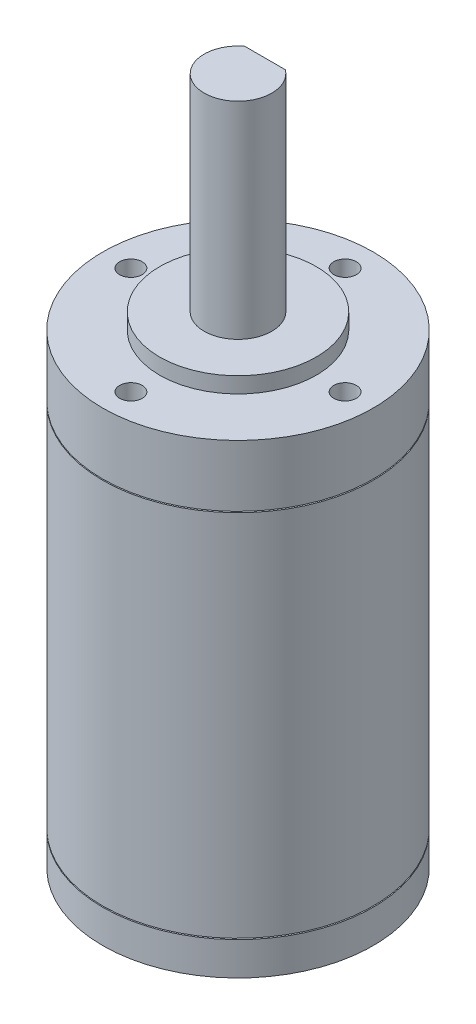
ISO-10303-21;
HEADER;
FILE_DESCRIPTION(('STEP AP214'),'2;1');
FILE_NAME('part.step','',(''),(''),'','','');
FILE_SCHEMA(('AUTOMOTIVE_DESIGN { 1 0 10303 214 1 1 1 1 }'));
ENDSEC;
DATA;
#1=APPLICATION_CONTEXT('core data for automotive mechanical design processes');
#2=APPLICATION_PROTOCOL_DEFINITION('international standard','automotive_design',2000,#1);
#3=PRODUCT_CONTEXT('',#1,'mechanical');
#4=PRODUCT('Part','Part','',(#3));
#5=PRODUCT_RELATED_PRODUCT_CATEGORY('part','',(#4));
#6=PRODUCT_DEFINITION_FORMATION('','',#4);
#7=PRODUCT_DEFINITION_CONTEXT('part definition',#1,'design');
#8=PRODUCT_DEFINITION('design','',#6,#7);
#9=PRODUCT_DEFINITION_SHAPE('','',#8);
#10=(LENGTH_UNIT() NAMED_UNIT(*) SI_UNIT(.MILLI.,.METRE.));
#11=(NAMED_UNIT(*) PLANE_ANGLE_UNIT() SI_UNIT($,.RADIAN.));
#12=(NAMED_UNIT(*) SI_UNIT($,.STERADIAN.) SOLID_ANGLE_UNIT());
#13=UNCERTAINTY_MEASURE_WITH_UNIT(LENGTH_MEASURE(1.E-05),#10,'distance_accuracy_value','');
#14=(GEOMETRIC_REPRESENTATION_CONTEXT(3) GLOBAL_UNCERTAINTY_ASSIGNED_CONTEXT((#13)) GLOBAL_UNIT_ASSIGNED_CONTEXT((#10,
#11,#12)) REPRESENTATION_CONTEXT('',''));
#15=CARTESIAN_POINT('',(0.,0.,0.));
#16=DIRECTION('',(0.,0.,1.));
#17=DIRECTION('',(1.,0.,0.));
#18=AXIS2_PLACEMENT_3D('',#15,#16,#17);
#19=CARTESIAN_POINT('',(0.,41.3,0.));
#20=DIRECTION('',(0.,-1.,0.));
#21=DIRECTION('',(0.,0.,-1.));
#22=AXIS2_PLACEMENT_3D('',#19,#20,#21);
#23=CYLINDRICAL_SURFACE('',#22,12.);
#24=CARTESIAN_POINT('',(0.,0.,0.));
#25=DIRECTION('',(0.,1.,0.));
#26=DIRECTION('',(0.,0.,1.));
#27=AXIS2_PLACEMENT_3D('',#24,#25,#26);
#28=CIRCLE('',#27,12.);
#29=CARTESIAN_POINT('',(0.,0.,-12.));
#30=VERTEX_POINT('',#29);
#31=EDGE_CURVE('E186',#30,#30,#28,.T.);
#32=CARTESIAN_POINT('',(0.,2.95,0.));
#33=DIRECTION('',(0.,1.,0.));
#34=DIRECTION('',(0.,0.,1.));
#35=AXIS2_PLACEMENT_3D('',#32,#33,#34);
#36=CIRCLE('',#35,12.);
#37=CARTESIAN_POINT('',(0.,2.94999999999999,-12.));
#38=VERTEX_POINT('',#37);
#39=EDGE_CURVE('E40',#38,#38,#36,.T.);
#40=CARTESIAN_POINT('',(0.,0.,-12.));
#41=CARTESIAN_POINT('',(0.,0.0307291666666668,-12.));
#42=CARTESIAN_POINT('',(0.,0.0614583333333335,-12.));
#43=CARTESIAN_POINT('',(0.,0.122916666666667,-12.));
#44=CARTESIAN_POINT('',(0.,0.153645833333334,-12.));
#45=CARTESIAN_POINT('',(0.,0.215104166666667,-12.));
#46=CARTESIAN_POINT('',(0.,0.245833333333334,-12.));
#47=CARTESIAN_POINT('',(0.,0.307291666666668,-12.));
#48=CARTESIAN_POINT('',(0.,0.338020833333334,-12.));
#49=CARTESIAN_POINT('',(0.,0.399479166666668,-12.));
#50=CARTESIAN_POINT('',(0.,0.430208333333335,-12.));
#51=CARTESIAN_POINT('',(0.,0.491666666666668,-12.));
#52=CARTESIAN_POINT('',(0.,0.522395833333335,-12.));
#53=CARTESIAN_POINT('',(0.,0.583854166666668,-12.));
#54=CARTESIAN_POINT('',(0.,0.614583333333335,-12.));
#55=CARTESIAN_POINT('',(0.,0.676041666666669,-12.));
#56=CARTESIAN_POINT('',(0.,0.706770833333335,-12.));
#57=CARTESIAN_POINT('',(0.,0.768229166666667,-12.));
#58=CARTESIAN_POINT('',(0.,0.798958333333331,-12.));
#59=CARTESIAN_POINT('',(0.,0.860416666666662,-12.));
#60=CARTESIAN_POINT('',(0.,0.891145833333329,-12.));
#61=CARTESIAN_POINT('',(0.,0.952604166666662,-12.));
#62=CARTESIAN_POINT('',(0.,0.983333333333329,-12.));
#63=CARTESIAN_POINT('',(0.,1.04479166666666,-12.));
#64=CARTESIAN_POINT('',(0.,1.07552083333333,-12.));
#65=CARTESIAN_POINT('',(0.,1.13697916666666,-12.));
#66=CARTESIAN_POINT('',(0.,1.16770833333333,-12.));
#67=CARTESIAN_POINT('',(0.,1.22916666666666,-12.));
#68=CARTESIAN_POINT('',(0.,1.25989583333333,-12.));
#69=CARTESIAN_POINT('',(0.,1.32135416666666,-12.));
#70=CARTESIAN_POINT('',(0.,1.35208333333333,-12.));
#71=CARTESIAN_POINT('',(0.,1.41354166666666,-12.));
#72=CARTESIAN_POINT('',(0.,1.44427083333333,-12.));
#73=CARTESIAN_POINT('',(0.,1.50572916666666,-12.));
#74=CARTESIAN_POINT('',(0.,1.53645833333333,-12.));
#75=CARTESIAN_POINT('',(0.,1.59791666666666,-12.));
#76=CARTESIAN_POINT('',(0.,1.62864583333333,-12.));
#77=CARTESIAN_POINT('',(0.,1.69010416666666,-12.));
#78=CARTESIAN_POINT('',(0.,1.72083333333333,-12.));
#79=CARTESIAN_POINT('',(0.,1.78229166666666,-12.));
#80=CARTESIAN_POINT('',(0.,1.81302083333333,-12.));
#81=CARTESIAN_POINT('',(0.,1.87447916666666,-12.));
#82=CARTESIAN_POINT('',(0.,1.90520833333333,-12.));
#83=CARTESIAN_POINT('',(0.,1.96666666666667,-12.));
#84=CARTESIAN_POINT('',(0.,1.99739583333333,-12.));
#85=CARTESIAN_POINT('',(0.,2.05885416666667,-12.));
#86=CARTESIAN_POINT('',(0.,2.08958333333333,-12.));
#87=CARTESIAN_POINT('',(0.,2.15104166666666,-12.));
#88=CARTESIAN_POINT('',(0.,2.18177083333333,-12.));
#89=CARTESIAN_POINT('',(0.,2.24322916666666,-12.));
#90=CARTESIAN_POINT('',(0.,2.27395833333333,-12.));
#91=CARTESIAN_POINT('',(0.,2.33541666666666,-12.));
#92=CARTESIAN_POINT('',(0.,2.36614583333333,-12.));
#93=CARTESIAN_POINT('',(0.,2.42760416666666,-12.));
#94=CARTESIAN_POINT('',(0.,2.45833333333333,-12.));
#95=CARTESIAN_POINT('',(0.,2.51979166666666,-12.));
#96=CARTESIAN_POINT('',(0.,2.55052083333333,-12.));
#97=CARTESIAN_POINT('',(0.,2.61197916666666,-12.));
#98=CARTESIAN_POINT('',(0.,2.64270833333333,-12.));
#99=CARTESIAN_POINT('',(0.,2.70416666666666,-12.));
#100=CARTESIAN_POINT('',(0.,2.73489583333333,-12.));
#101=CARTESIAN_POINT('',(0.,2.79635416666666,-12.));
#102=CARTESIAN_POINT('',(0.,2.82708333333333,-12.));
#103=CARTESIAN_POINT('',(0.,2.88854166666666,-12.));
#104=CARTESIAN_POINT('',(0.,2.91927083333333,-12.));
#105=CARTESIAN_POINT('',(0.,2.94999999999999,-12.));
#106=B_SPLINE_CURVE_WITH_KNOTS('',3,(#40,#41,#42,#43,#44,#45,#46,#47,#48,#49,#50,#51,#52,#53,
#54,#55,#56,#57,#58,#59,#60,#61,#62,#63,#64,#65,#66,#67,#68,#69,#70,#71,#72,#73,#74,#75,#76,#77,
#78,#79,#80,#81,#82,#83,#84,#85,#86,#87,#88,#89,#90,#91,#92,#93,#94,#95,#96,#97,#98,#99,#100,
#101,#102,#103,#104,#105),.UNSPECIFIED.,.F.,.F.,(4,2,2,2,2,2,2,2,2,2,2,2,2,2,2,2,2,2,2,2,2,2,2,
2,2,2,2,2,2,2,2,2,4),(0.,0.0921875000000003,0.184375000000001,0.276562500000001,
0.368750000000001,0.460937500000001,0.553125000000002,0.645312500000002,0.737500000000002,
0.829687499999995,0.921874999999996,1.0140625,1.10625,1.1984375,1.290625,1.3828125,1.475,
1.5671875,1.659375,1.7515625,1.84375,1.9359375,2.028125,2.1203125,2.21249999999999,
2.30468749999999,2.39687499999999,2.48906249999999,2.58124999999999,2.67343749999999,
2.76562499999999,2.85781249999999,2.94999999999999),.UNSPECIFIED.);
#107=EDGE_CURVE('BSEAM36',#30,#38,#106,.T.);
#108=ORIENTED_EDGE('',*,*,#31,.T.);
#109=ORIENTED_EDGE('',*,*,#39,.F.);
#110=ORIENTED_EDGE('',*,*,#107,.T.);
#111=ORIENTED_EDGE('',*,*,#107,.F.);
#112=EDGE_LOOP('',(#108,#110,#109,#111));
#113=FACE_BOUND('',#112,.T.);
#114=ADVANCED_FACE('F36',(#113),#23,.T.);
#115=CARTESIAN_POINT('',(0.,35.75,0.));
#116=DIRECTION('',(0.,1.,0.));
#117=DIRECTION('',(0.,0.,1.));
#118=AXIS2_PLACEMENT_3D('',#115,#116,#117);
#119=CIRCLE('',#118,12.);
#120=CARTESIAN_POINT('',(0.,35.75,-12.));
#121=VERTEX_POINT('',#120);
#122=EDGE_CURVE('E242',#121,#121,#119,.T.);
#123=CARTESIAN_POINT('',(0.,3.05,0.));
#124=DIRECTION('',(0.,-1.,0.));
#125=DIRECTION('',(0.,0.,-1.));
#126=AXIS2_PLACEMENT_3D('',#123,#124,#125);
#127=CIRCLE('',#126,12.);
#128=CARTESIAN_POINT('',(0.,3.05,-12.));
#129=VERTEX_POINT('',#128);
#130=EDGE_CURVE('E245',#129,#129,#127,.T.);
#131=CARTESIAN_POINT('',(0.,35.75,-12.));
#132=CARTESIAN_POINT('',(0.,35.409375,-12.));
#133=CARTESIAN_POINT('',(0.,35.06875,-12.));
#134=CARTESIAN_POINT('',(0.,34.3875,-12.));
#135=CARTESIAN_POINT('',(0.,34.046875,-12.));
#136=CARTESIAN_POINT('',(0.,33.365625,-12.));
#137=CARTESIAN_POINT('',(0.,33.025,-12.));
#138=CARTESIAN_POINT('',(0.,32.34375,-12.));
#139=CARTESIAN_POINT('',(0.,32.003125,-12.));
#140=CARTESIAN_POINT('',(0.,31.321875,-12.));
#141=CARTESIAN_POINT('',(0.,30.98125,-12.));
#142=CARTESIAN_POINT('',(0.,30.3,-12.));
#143=CARTESIAN_POINT('',(0.,29.959375,-12.));
#144=CARTESIAN_POINT('',(0.,29.278125,-12.));
#145=CARTESIAN_POINT('',(0.,28.9375,-12.));
#146=CARTESIAN_POINT('',(0.,28.25625,-12.));
#147=CARTESIAN_POINT('',(0.,27.915625,-12.));
#148=CARTESIAN_POINT('',(0.,27.234375,-12.));
#149=CARTESIAN_POINT('',(0.,26.89375,-12.));
#150=CARTESIAN_POINT('',(0.,26.2125,-12.));
#151=CARTESIAN_POINT('',(0.,25.871875,-12.));
#152=CARTESIAN_POINT('',(0.,25.190625,-12.));
#153=CARTESIAN_POINT('',(0.,24.85,-12.));
#154=CARTESIAN_POINT('',(0.,24.16875,-12.));
#155=CARTESIAN_POINT('',(0.,23.828125,-12.));
#156=CARTESIAN_POINT('',(0.,23.146875,-12.));
#157=CARTESIAN_POINT('',(0.,22.80625,-12.));
#158=CARTESIAN_POINT('',(0.,22.125,-12.));
#159=CARTESIAN_POINT('',(0.,21.784375,-12.));
#160=CARTESIAN_POINT('',(0.,21.103125,-12.));
#161=CARTESIAN_POINT('',(0.,20.7625,-12.));
#162=CARTESIAN_POINT('',(0.,20.08125,-12.));
#163=CARTESIAN_POINT('',(0.,19.740625,-12.));
#164=CARTESIAN_POINT('',(0.,19.059375,-12.));
#165=CARTESIAN_POINT('',(0.,18.71875,-12.));
#166=CARTESIAN_POINT('',(0.,18.0375,-12.));
#167=CARTESIAN_POINT('',(0.,17.696875,-12.));
#168=CARTESIAN_POINT('',(0.,17.015625,-12.));
#169=CARTESIAN_POINT('',(0.,16.675,-12.));
#170=CARTESIAN_POINT('',(0.,15.99375,-12.));
#171=CARTESIAN_POINT('',(0.,15.653125,-12.));
#172=CARTESIAN_POINT('',(0.,14.971875,-12.));
#173=CARTESIAN_POINT('',(0.,14.63125,-12.));
#174=CARTESIAN_POINT('',(0.,13.95,-12.));
#175=CARTESIAN_POINT('',(0.,13.609375,-12.));
#176=CARTESIAN_POINT('',(0.,12.928125,-12.));
#177=CARTESIAN_POINT('',(0.,12.5875,-12.));
#178=CARTESIAN_POINT('',(0.,11.90625,-12.));
#179=CARTESIAN_POINT('',(0.,11.565625,-12.));
#180=CARTESIAN_POINT('',(0.,10.884375,-12.));
#181=CARTESIAN_POINT('',(0.,10.54375,-12.));
#182=CARTESIAN_POINT('',(0.,9.8625,-12.));
#183=CARTESIAN_POINT('',(0.,9.521875,-12.));
#184=CARTESIAN_POINT('',(0.,8.840625,-12.));
#185=CARTESIAN_POINT('',(0.,8.5,-12.));
#186=CARTESIAN_POINT('',(0.,7.81875,-12.));
#187=CARTESIAN_POINT('',(0.,7.478125,-12.));
#188=CARTESIAN_POINT('',(0.,6.796875,-12.));
#189=CARTESIAN_POINT('',(0.,6.45625,-12.));
#190=CARTESIAN_POINT('',(0.,5.775,-12.));
#191=CARTESIAN_POINT('',(0.,5.434375,-12.));
#192=CARTESIAN_POINT('',(0.,4.753125,-12.));
#193=CARTESIAN_POINT('',(0.,4.4125,-12.));
#194=CARTESIAN_POINT('',(0.,3.73125,-12.));
#195=CARTESIAN_POINT('',(0.,3.390625,-12.));
#196=CARTESIAN_POINT('',(0.,3.05,-12.));
#197=B_SPLINE_CURVE_WITH_KNOTS('',3,(#131,#132,#133,#134,#135,#136,#137,#138,#139,#140,#141,
#142,#143,#144,#145,#146,#147,#148,#149,#150,#151,#152,#153,#154,#155,#156,#157,#158,#159,#160,
#161,#162,#163,#164,#165,#166,#167,#168,#169,#170,#171,#172,#173,#174,#175,#176,#177,#178,#179,
#180,#181,#182,#183,#184,#185,#186,#187,#188,#189,#190,#191,#192,#193,#194,#195,#196),
.UNSPECIFIED.,.F.,.F.,(4,2,2,2,2,2,2,2,2,2,2,2,2,2,2,2,2,2,2,2,2,2,2,2,2,2,2,2,2,2,2,2,4),(0.,
1.021875,2.04375,3.065625,4.0875,5.109375,6.13125,7.153125,8.175,9.196875,10.21875,11.240625,
12.2625,13.284375,14.30625,15.328125,16.35,17.371875,18.39375,19.415625,20.4375,21.459375,
22.48125,23.503125,24.525,25.546875,26.56875,27.590625,28.6125,29.634375,30.65625,31.678125,
32.7),.UNSPECIFIED.);
#198=EDGE_CURVE('BSEAM303',#121,#129,#197,.T.);
#199=ORIENTED_EDGE('',*,*,#122,.F.);
#200=ORIENTED_EDGE('',*,*,#130,.F.);
#201=ORIENTED_EDGE('',*,*,#198,.T.);
#202=ORIENTED_EDGE('',*,*,#198,.F.);
#203=EDGE_LOOP('',(#199,#201,#200,#202));
#204=FACE_BOUND('',#203,.T.);
#205=ADVANCED_FACE('F303',(#204),#23,.T.);
#206=CARTESIAN_POINT('',(0.,41.3,0.));
#207=DIRECTION('',(0.,1.,0.));
#208=DIRECTION('',(0.,0.,1.));
#209=AXIS2_PLACEMENT_3D('',#206,#207,#208);
#210=CIRCLE('',#209,12.);
#211=CARTESIAN_POINT('',(0.,41.3,-12.));
#212=VERTEX_POINT('',#211);
#213=EDGE_CURVE('E189',#212,#212,#210,.T.);
#214=CARTESIAN_POINT('',(0.,35.85,0.));
#215=DIRECTION('',(0.,-1.,0.));
#216=DIRECTION('',(0.,0.,-1.));
#217=AXIS2_PLACEMENT_3D('',#214,#215,#216);
#218=CIRCLE('',#217,12.);
#219=CARTESIAN_POINT('',(0.,35.85,-12.));
#220=VERTEX_POINT('',#219);
#221=EDGE_CURVE('E239',#220,#220,#218,.T.);
#222=CARTESIAN_POINT('',(0.,41.3,-12.));
#223=CARTESIAN_POINT('',(0.,41.2432291666667,-12.));
#224=CARTESIAN_POINT('',(0.,41.1864583333333,-12.));
#225=CARTESIAN_POINT('',(0.,41.0729166666667,-12.));
#226=CARTESIAN_POINT('',(0.,41.0161458333333,-12.));
#227=CARTESIAN_POINT('',(0.,40.9026041666667,-12.));
#228=CARTESIAN_POINT('',(0.,40.8458333333333,-12.));
#229=CARTESIAN_POINT('',(0.,40.7322916666667,-12.));
#230=CARTESIAN_POINT('',(0.,40.6755208333333,-12.));
#231=CARTESIAN_POINT('',(0.,40.5619791666667,-12.));
#232=CARTESIAN_POINT('',(0.,40.5052083333333,-12.));
#233=CARTESIAN_POINT('',(0.,40.3916666666667,-12.));
#234=CARTESIAN_POINT('',(0.,40.3348958333333,-12.));
#235=CARTESIAN_POINT('',(0.,40.2213541666667,-12.));
#236=CARTESIAN_POINT('',(0.,40.1645833333333,-12.));
#237=CARTESIAN_POINT('',(0.,40.0510416666667,-12.));
#238=CARTESIAN_POINT('',(0.,39.9942708333333,-12.));
#239=CARTESIAN_POINT('',(0.,39.8807291666667,-12.));
#240=CARTESIAN_POINT('',(0.,39.8239583333333,-12.));
#241=CARTESIAN_POINT('',(0.,39.7104166666667,-12.));
#242=CARTESIAN_POINT('',(0.,39.6536458333333,-12.));
#243=CARTESIAN_POINT('',(0.,39.5401041666667,-12.));
#244=CARTESIAN_POINT('',(0.,39.4833333333333,-12.));
#245=CARTESIAN_POINT('',(0.,39.3697916666667,-12.));
#246=CARTESIAN_POINT('',(0.,39.3130208333333,-12.));
#247=CARTESIAN_POINT('',(0.,39.1994791666667,-12.));
#248=CARTESIAN_POINT('',(0.,39.1427083333333,-12.));
#249=CARTESIAN_POINT('',(0.,39.0291666666667,-12.));
#250=CARTESIAN_POINT('',(0.,38.9723958333333,-12.));
#251=CARTESIAN_POINT('',(0.,38.8588541666667,-12.));
#252=CARTESIAN_POINT('',(0.,38.8020833333333,-12.));
#253=CARTESIAN_POINT('',(0.,38.6885416666667,-12.));
#254=CARTESIAN_POINT('',(0.,38.6317708333333,-12.));
#255=CARTESIAN_POINT('',(0.,38.5182291666667,-12.));
#256=CARTESIAN_POINT('',(0.,38.4614583333333,-12.));
#257=CARTESIAN_POINT('',(0.,38.3479166666667,-12.));
#258=CARTESIAN_POINT('',(0.,38.2911458333333,-12.));
#259=CARTESIAN_POINT('',(0.,38.1776041666667,-12.));
#260=CARTESIAN_POINT('',(0.,38.1208333333333,-12.));
#261=CARTESIAN_POINT('',(0.,38.0072916666667,-12.));
#262=CARTESIAN_POINT('',(0.,37.9505208333333,-12.));
#263=CARTESIAN_POINT('',(0.,37.8369791666667,-12.));
#264=CARTESIAN_POINT('',(0.,37.7802083333333,-12.));
#265=CARTESIAN_POINT('',(0.,37.6666666666667,-12.));
#266=CARTESIAN_POINT('',(0.,37.6098958333333,-12.));
#267=CARTESIAN_POINT('',(0.,37.4963541666667,-12.));
#268=CARTESIAN_POINT('',(0.,37.4395833333333,-12.));
#269=CARTESIAN_POINT('',(0.,37.3260416666667,-12.));
#270=CARTESIAN_POINT('',(0.,37.2692708333333,-12.));
#271=CARTESIAN_POINT('',(0.,37.1557291666667,-12.));
#272=CARTESIAN_POINT('',(0.,37.0989583333333,-12.));
#273=CARTESIAN_POINT('',(0.,36.9854166666667,-12.));
#274=CARTESIAN_POINT('',(0.,36.9286458333333,-12.));
#275=CARTESIAN_POINT('',(0.,36.8151041666667,-12.));
#276=CARTESIAN_POINT('',(0.,36.7583333333333,-12.));
#277=CARTESIAN_POINT('',(0.,36.6447916666667,-12.));
#278=CARTESIAN_POINT('',(0.,36.5880208333333,-12.));
#279=CARTESIAN_POINT('',(0.,36.4744791666667,-12.));
#280=CARTESIAN_POINT('',(0.,36.4177083333333,-12.));
#281=CARTESIAN_POINT('',(0.,36.3041666666667,-12.));
#282=CARTESIAN_POINT('',(0.,36.2473958333333,-12.));
#283=CARTESIAN_POINT('',(0.,36.1338541666667,-12.));
#284=CARTESIAN_POINT('',(0.,36.0770833333333,-12.));
#285=CARTESIAN_POINT('',(0.,35.9635416666667,-12.));
#286=CARTESIAN_POINT('',(0.,35.9067708333333,-12.));
#287=CARTESIAN_POINT('',(0.,35.85,-12.));
#288=B_SPLINE_CURVE_WITH_KNOTS('',3,(#222,#223,#224,#225,#226,#227,#228,#229,#230,#231,#232,
#233,#234,#235,#236,#237,#238,#239,#240,#241,#242,#243,#244,#245,#246,#247,#248,#249,#250,#251,
#252,#253,#254,#255,#256,#257,#258,#259,#260,#261,#262,#263,#264,#265,#266,#267,#268,#269,#270,
#271,#272,#273,#274,#275,#276,#277,#278,#279,#280,#281,#282,#283,#284,#285,#286,#287),
.UNSPECIFIED.,.F.,.F.,(4,2,2,2,2,2,2,2,2,2,2,2,2,2,2,2,2,2,2,2,2,2,2,2,2,2,2,2,2,2,2,2,4),(0.,
0.170312500000006,0.340625000000004,0.510937500000003,0.681250000000001,0.8515625,1.021875,
1.1921875,1.3625,1.5328125,1.703125,1.8734375,2.04375,2.2140625,2.384375,2.5546875,2.725,
2.8953125,3.065625,3.2359375,3.40625,3.5765625,3.746875,3.9171875,4.08749999999999,
4.25781249999999,4.428125,4.5984375,4.76875,4.93906249999999,5.10937499999999,5.2796875,5.45),.UNSPECIFIED.);
#289=EDGE_CURVE('BSEAM306',#212,#220,#288,.T.);
#290=ORIENTED_EDGE('',*,*,#213,.F.);
#291=ORIENTED_EDGE('',*,*,#221,.F.);
#292=ORIENTED_EDGE('',*,*,#289,.T.);
#293=ORIENTED_EDGE('',*,*,#289,.F.);
#294=EDGE_LOOP('',(#290,#292,#291,#293));
#295=FACE_BOUND('',#294,.T.);
#296=ADVANCED_FACE('F306',(#295),#23,.T.);
#297=CARTESIAN_POINT('',(0.,42.7,0.));
#298=DIRECTION('',(0.,1.,0.));
#299=DIRECTION('',(0.,0.,1.));
#300=AXIS2_PLACEMENT_3D('',#297,#298,#299);
#301=PLANE('',#300);
#302=CARTESIAN_POINT('',(0.,42.7,0.));
#303=DIRECTION('',(0.,1.,0.));
#304=DIRECTION('',(0.,0.,1.));
#305=AXIS2_PLACEMENT_3D('',#302,#303,#304);
#306=CIRCLE('',#305,6.95);
#307=CARTESIAN_POINT('',(0.,42.7,6.95));
#308=VERTEX_POINT('',#307);
#309=EDGE_CURVE('E183',#308,#308,#306,.T.);
#310=ORIENTED_EDGE('',*,*,#309,.T.);
#311=EDGE_LOOP('',(#310));
#312=FACE_BOUND('',#311,.T.);
#313=CARTESIAN_POINT('',(0.,42.7,0.));
#314=DIRECTION('',(0.,1.,0.));
#315=DIRECTION('',(0.,0.,1.));
#316=AXIS2_PLACEMENT_3D('',#313,#314,#315);
#317=CIRCLE('',#316,3.);
#318=CARTESIAN_POINT('',(0.,42.7,3.));
#319=VERTEX_POINT('',#318);
#320=EDGE_CURVE('E176',#319,#319,#317,.T.);
#321=ORIENTED_EDGE('',*,*,#320,.F.);
#322=EDGE_LOOP('',(#321));
#323=FACE_BOUND('',#322,.T.);
#324=ADVANCED_FACE('F274',(#312,#323),#301,.T.);
#325=CARTESIAN_POINT('',(0.,41.3,0.));
#326=DIRECTION('',(0.,1.,0.));
#327=DIRECTION('',(0.,0.,1.));
#328=AXIS2_PLACEMENT_3D('',#325,#326,#327);
#329=PLANE('',#328);
#330=CARTESIAN_POINT('',(-9.5,41.3,0.));
#331=DIRECTION('',(0.,1.,0.));
#332=DIRECTION('',(1.,0.,0.));
#333=AXIS2_PLACEMENT_3D('',#330,#331,#332);
#334=CIRCLE('',#333,1.);
#335=CARTESIAN_POINT('',(-8.5,41.3,0.));
#336=VERTEX_POINT('',#335);
#337=EDGE_CURVE('E122',#336,#336,#334,.T.);
#338=ORIENTED_EDGE('',*,*,#337,.F.);
#339=EDGE_LOOP('',(#338));
#340=FACE_BOUND('',#339,.T.);
#341=CARTESIAN_POINT('',(0.,41.3,9.5));
#342=DIRECTION('',(0.,1.,0.));
#343=DIRECTION('',(0.,0.,-1.));
#344=AXIS2_PLACEMENT_3D('',#341,#342,#343);
#345=CIRCLE('',#344,1.);
#346=CARTESIAN_POINT('',(0.,41.3,8.5));
#347=VERTEX_POINT('',#346);
#348=EDGE_CURVE('E130',#347,#347,#345,.T.);
#349=ORIENTED_EDGE('',*,*,#348,.F.);
#350=EDGE_LOOP('',(#349));
#351=FACE_BOUND('',#350,.T.);
#352=CARTESIAN_POINT('',(9.5,41.3,0.));
#353=DIRECTION('',(0.,1.,0.));
#354=DIRECTION('',(-1.,0.,0.));
#355=AXIS2_PLACEMENT_3D('',#352,#353,#354);
#356=CIRCLE('',#355,1.);
#357=CARTESIAN_POINT('',(8.5,41.3,0.));
#358=VERTEX_POINT('',#357);
#359=EDGE_CURVE('E144',#358,#358,#356,.T.);
#360=ORIENTED_EDGE('',*,*,#359,.F.);
#361=EDGE_LOOP('',(#360));
#362=FACE_BOUND('',#361,.T.);
#363=CARTESIAN_POINT('',(0.,41.3,-9.5));
#364=DIRECTION('',(0.,1.,0.));
#365=DIRECTION('',(0.,0.,1.));
#366=AXIS2_PLACEMENT_3D('',#363,#364,#365);
#367=CIRCLE('',#366,1.);
#368=CARTESIAN_POINT('',(0.,41.3,-8.5));
#369=VERTEX_POINT('',#368);
#370=EDGE_CURVE('E155',#369,#369,#367,.T.);
#371=ORIENTED_EDGE('',*,*,#370,.F.);
#372=EDGE_LOOP('',(#371));
#373=FACE_BOUND('',#372,.T.);
#374=ORIENTED_EDGE('',*,*,#213,.T.);
#375=EDGE_LOOP('',(#374));
#376=FACE_BOUND('',#375,.T.);
#377=CARTESIAN_POINT('',(0.,41.3,0.));
#378=DIRECTION('',(0.,1.,0.));
#379=DIRECTION('',(0.,0.,1.));
#380=AXIS2_PLACEMENT_3D('',#377,#378,#379);
#381=CIRCLE('',#380,6.95);
#382=CARTESIAN_POINT('',(0.,41.3,6.95));
#383=VERTEX_POINT('',#382);
#384=EDGE_CURVE('E180',#383,#383,#381,.T.);
#385=ORIENTED_EDGE('',*,*,#384,.F.);
#386=EDGE_LOOP('',(#385));
#387=FACE_BOUND('',#386,.T.);
#388=ADVANCED_FACE('F270',(#340,#351,#362,#373,#376,#387),#329,.T.);
#389=CARTESIAN_POINT('',(0.,0.,0.));
#390=DIRECTION('',(0.,1.,0.));
#391=DIRECTION('',(0.,0.,1.));
#392=AXIS2_PLACEMENT_3D('',#389,#390,#391);
#393=PLANE('',#392);
#394=CARTESIAN_POINT('',(0.,0.,-8.));
#395=DIRECTION('',(0.,-1.,0.));
#396=DIRECTION('',(0.,0.,1.));
#397=AXIS2_PLACEMENT_3D('',#394,#395,#396);
#398=CIRCLE('',#397,1.5);
#399=CARTESIAN_POINT('',(0.,0.,-6.5));
#400=VERTEX_POINT('',#399);
#401=EDGE_CURVE('E238',#400,#400,#398,.T.);
#402=ORIENTED_EDGE('',*,*,#401,.F.);
#403=EDGE_LOOP('',(#402));
#404=FACE_BOUND('',#403,.T.);
#405=CARTESIAN_POINT('',(0.,0.,8.));
#406=DIRECTION('',(0.,-1.,0.));
#407=DIRECTION('',(0.,0.,-1.));
#408=AXIS2_PLACEMENT_3D('',#405,#406,#407);
#409=CIRCLE('',#408,1.5);
#410=CARTESIAN_POINT('',(0.,0.,6.5));
#411=VERTEX_POINT('',#410);
#412=EDGE_CURVE('E234',#411,#411,#409,.T.);
#413=ORIENTED_EDGE('',*,*,#412,.F.);
#414=EDGE_LOOP('',(#413));
#415=FACE_BOUND('',#414,.T.);
#416=CARTESIAN_POINT('',(0.,0.,0.));
#417=DIRECTION('',(0.,1.,0.));
#418=DIRECTION('',(0.,0.,1.));
#419=AXIS2_PLACEMENT_3D('',#416,#417,#418);
#420=CIRCLE('',#419,4.);
#421=CARTESIAN_POINT('',(0.,0.,4.));
#422=VERTEX_POINT('',#421);
#423=EDGE_CURVE('E209',#422,#422,#420,.T.);
#424=ORIENTED_EDGE('',*,*,#423,.T.);
#425=EDGE_LOOP('',(#424));
#426=FACE_BOUND('',#425,.T.);
#427=ORIENTED_EDGE('',*,*,#31,.F.);
#428=EDGE_LOOP('',(#427));
#429=FACE_BOUND('',#428,.T.);
#430=ADVANCED_FACE('F273',(#404,#415,#426,#429),#393,.F.);
#431=CARTESIAN_POINT('',(0.,42.7,0.));
#432=DIRECTION('',(0.,-1.,0.));
#433=DIRECTION('',(0.,0.,-1.));
#434=AXIS2_PLACEMENT_3D('',#431,#432,#433);
#435=CYLINDRICAL_SURFACE('',#434,6.95);
#436=ORIENTED_EDGE('',*,*,#309,.F.);
#437=EDGE_LOOP('',(#436));
#438=FACE_BOUND('',#437,.T.);
#439=ORIENTED_EDGE('',*,*,#384,.T.);
#440=EDGE_LOOP('',(#439));
#441=FACE_BOUND('',#440,.T.);
#442=ADVANCED_FACE('F286',(#438,#441),#435,.T.);
#443=CARTESIAN_POINT('',(0.,61.,0.));
#444=DIRECTION('',(0.,-1.,0.));
#445=DIRECTION('',(0.,0.,-1.));
#446=AXIS2_PLACEMENT_3D('',#443,#444,#445);
#447=CYLINDRICAL_SURFACE('',#446,3.);
#448=CARTESIAN_POINT('',(0.,61.,0.));
#449=DIRECTION('',(0.,1.,0.));
#450=DIRECTION('',(0.,0.,1.));
#451=AXIS2_PLACEMENT_3D('',#448,#449,#450);
#452=CIRCLE('',#451,3.);
#453=CARTESIAN_POINT('',(-1.8,61.,-2.4));
#454=VERTEX_POINT('',#453);
#455=CARTESIAN_POINT('',(1.8,61.,-2.4));
#456=VERTEX_POINT('',#455);
#457=EDGE_CURVE('E177',#454,#456,#452,.T.);
#458=ORIENTED_EDGE('',*,*,#457,.F.);
#459=DIRECTION('',(0.,-1.,0.));
#460=VECTOR('',#459,1.);
#461=CARTESIAN_POINT('',(-1.8,61.,-2.4));
#462=LINE('',#461,#460);
#463=CARTESIAN_POINT('',(-1.8,46.,-2.4));
#464=VERTEX_POINT('',#463);
#465=EDGE_CURVE('E173',#454,#464,#462,.T.);
#466=ORIENTED_EDGE('',*,*,#465,.T.);
#467=CARTESIAN_POINT('',(0.,46.,0.));
#468=DIRECTION('',(0.,-1.,0.));
#469=DIRECTION('',(0.,0.,-1.));
#470=AXIS2_PLACEMENT_3D('',#467,#468,#469);
#471=CIRCLE('',#470,3.);
#472=CARTESIAN_POINT('',(1.8,46.,-2.4));
#473=VERTEX_POINT('',#472);
#474=EDGE_CURVE('E201',#464,#473,#471,.T.);
#475=ORIENTED_EDGE('',*,*,#474,.T.);
#476=DIRECTION('',(0.,-1.,0.));
#477=VECTOR('',#476,1.);
#478=CARTESIAN_POINT('',(1.8,61.,-2.4));
#479=LINE('',#478,#477);
#480=EDGE_CURVE('E170',#473,#456,#479,.F.);
#481=ORIENTED_EDGE('',*,*,#480,.T.);
#482=EDGE_LOOP('',(#458,#466,#475,#481));
#483=FACE_BOUND('',#482,.T.);
#484=ORIENTED_EDGE('',*,*,#320,.T.);
#485=EDGE_LOOP('',(#484));
#486=FACE_BOUND('',#485,.T.);
#487=ADVANCED_FACE('F288',(#483,#486),#447,.T.);
#488=CARTESIAN_POINT('',(0.,61.,0.));
#489=DIRECTION('',(0.,1.,0.));
#490=DIRECTION('',(0.,0.,1.));
#491=AXIS2_PLACEMENT_3D('',#488,#489,#490);
#492=PLANE('',#491);
#493=DIRECTION('',(1.,0.,0.));
#494=VECTOR('',#493,1.);
#495=CARTESIAN_POINT('',(0.,61.,-2.4));
#496=LINE('',#495,#494);
#497=EDGE_CURVE('E196',#454,#456,#496,.T.);
#498=ORIENTED_EDGE('',*,*,#497,.F.);
#499=ORIENTED_EDGE('',*,*,#457,.T.);
#500=EDGE_LOOP('',(#498,#499));
#501=FACE_BOUND('',#500,.T.);
#502=ADVANCED_FACE('F295',(#501),#492,.T.);
#503=CARTESIAN_POINT('',(0.,46.,0.));
#504=DIRECTION('',(0.,-1.,0.));
#505=DIRECTION('',(0.,0.,-1.));
#506=AXIS2_PLACEMENT_3D('',#503,#504,#505);
#507=PLANE('',#506);
#508=DIRECTION('',(1.,0.,0.));
#509=VECTOR('',#508,1.);
#510=CARTESIAN_POINT('',(-4.18038896908084,46.,-2.4));
#511=LINE('',#510,#509);
#512=EDGE_CURVE('E167',#464,#473,#511,.T.);
#513=ORIENTED_EDGE('',*,*,#512,.T.);
#514=ORIENTED_EDGE('',*,*,#474,.F.);
#515=EDGE_LOOP('',(#513,#514));
#516=FACE_BOUND('',#515,.T.);
#517=ADVANCED_FACE('F381',(#516),#507,.F.);
#518=CARTESIAN_POINT('',(-4.18038896908084,46.,-2.4));
#519=DIRECTION('',(0.,0.,1.));
#520=DIRECTION('',(1.,0.,0.));
#521=AXIS2_PLACEMENT_3D('',#518,#519,#520);
#522=PLANE('',#521);
#523=ORIENTED_EDGE('',*,*,#497,.T.);
#524=ORIENTED_EDGE('',*,*,#480,.F.);
#525=ORIENTED_EDGE('',*,*,#512,.F.);
#526=ORIENTED_EDGE('',*,*,#465,.F.);
#527=EDGE_LOOP('',(#523,#524,#525,#526));
#528=FACE_BOUND('',#527,.T.);
#529=ADVANCED_FACE('F379',(#528),#522,.F.);
#530=CARTESIAN_POINT('',(0.,10.,0.));
#531=DIRECTION('',(0.,-1.,0.));
#532=DIRECTION('',(0.,0.,-1.));
#533=AXIS2_PLACEMENT_3D('',#530,#531,#532);
#534=CYLINDRICAL_SURFACE('',#533,3.1);
#535=CARTESIAN_POINT('',(0.,0.899999999999995,0.));
#536=DIRECTION('',(0.,1.,0.));
#537=DIRECTION('',(0.,0.,1.));
#538=AXIS2_PLACEMENT_3D('',#535,#536,#537);
#539=CIRCLE('',#538,3.1);
#540=CARTESIAN_POINT('',(0.,0.899999999999995,3.1));
#541=VERTEX_POINT('',#540);
#542=EDGE_CURVE('E204',#541,#541,#539,.F.);
#543=ORIENTED_EDGE('',*,*,#542,.T.);
#544=EDGE_LOOP('',(#543));
#545=FACE_BOUND('',#544,.T.);
#546=CARTESIAN_POINT('',(0.,2.1,0.));
#547=DIRECTION('',(0.,1.,0.));
#548=DIRECTION('',(0.,0.,1.));
#549=AXIS2_PLACEMENT_3D('',#546,#547,#548);
#550=CIRCLE('',#549,3.1);
#551=CARTESIAN_POINT('',(0.,2.1,3.1));
#552=VERTEX_POINT('',#551);
#553=EDGE_CURVE('E166',#552,#552,#550,.T.);
#554=ORIENTED_EDGE('',*,*,#553,.T.);
#555=EDGE_LOOP('',(#554));
#556=FACE_BOUND('',#555,.T.);
#557=ADVANCED_FACE('F376',(#545,#556),#534,.F.);
#558=CARTESIAN_POINT('',(0.,41.3,0.));
#559=DIRECTION('',(0.,-1.,0.));
#560=DIRECTION('',(0.,0.,-1.));
#561=AXIS2_PLACEMENT_3D('',#558,#559,#560);
#562=CYLINDRICAL_SURFACE('',#561,9.9);
#563=DIRECTION('',(0.,1.,0.));
#564=VECTOR('',#563,1.);
#565=CARTESIAN_POINT('',(-9.85578947368421,36.3,-0.934566129503794));
#566=LINE('',#565,#564);
#567=CARTESIAN_POINT('',(-9.8557894736842,31.3,-0.934566129503795));
#568=VERTEX_POINT('',#567);
#569=CARTESIAN_POINT('',(-9.8557894736842,39.2,-0.93456612950379));
#570=VERTEX_POINT('',#569);
#571=EDGE_CURVE('E53',#568,#570,#566,.T.);
#572=ORIENTED_EDGE('',*,*,#571,.F.);
#573=CARTESIAN_POINT('',(0.,31.3,0.));
#574=DIRECTION('',(0.,1.,0.));
#575=DIRECTION('',(0.,0.,1.));
#576=AXIS2_PLACEMENT_3D('',#573,#574,#575);
#577=CIRCLE('',#576,9.9);
#578=CARTESIAN_POINT('',(-9.85578947368422,31.3,0.934566129503588));
#579=VERTEX_POINT('',#578);
#580=EDGE_CURVE('E11',#568,#579,#577,.T.);
#581=ORIENTED_EDGE('',*,*,#580,.T.);
#582=DIRECTION('',(0.,1.,0.));
#583=VECTOR('',#582,1.);
#584=CARTESIAN_POINT('',(-9.85578947368423,36.3,0.934566129503588));
#585=LINE('',#584,#583);
#586=CARTESIAN_POINT('',(-9.85578947368422,39.2,0.934566129503584));
#587=VERTEX_POINT('',#586);
#588=EDGE_CURVE('E121',#587,#579,#585,.F.);
#589=ORIENTED_EDGE('',*,*,#588,.F.);
#590=CARTESIAN_POINT('',(0.,39.2,0.));
#591=DIRECTION('',(0.,1.,0.));
#592=DIRECTION('',(0.,0.,1.));
#593=AXIS2_PLACEMENT_3D('',#590,#591,#592);
#594=CIRCLE('',#593,9.9);
#595=CARTESIAN_POINT('',(-0.934566129503687,39.2,9.85578947368421));
#596=VERTEX_POINT('',#595);
#597=EDGE_CURVE('E61',#587,#596,#594,.T.);
#598=ORIENTED_EDGE('',*,*,#597,.T.);
#599=DIRECTION('',(0.,1.,0.));
#600=VECTOR('',#599,1.);
#601=CARTESIAN_POINT('',(-0.934566129503691,36.3,9.85578947368422));
#602=LINE('',#601,#600);
#603=CARTESIAN_POINT('',(-0.934566129503692,31.3,9.85578947368421));
#604=VERTEX_POINT('',#603);
#605=EDGE_CURVE('E142',#604,#596,#602,.T.);
#606=ORIENTED_EDGE('',*,*,#605,.F.);
#607=CARTESIAN_POINT('',(0.,31.3,0.));
#608=DIRECTION('',(0.,1.,0.));
#609=DIRECTION('',(0.,0.,1.));
#610=AXIS2_PLACEMENT_3D('',#607,#608,#609);
#611=CIRCLE('',#610,9.9);
#612=CARTESIAN_POINT('',(0.934566129503692,31.3,9.85578947368421));
#613=VERTEX_POINT('',#612);
#614=EDGE_CURVE('E227',#604,#613,#611,.T.);
#615=ORIENTED_EDGE('',*,*,#614,.T.);
#616=DIRECTION('',(0.,1.,0.));
#617=VECTOR('',#616,1.);
#618=CARTESIAN_POINT('',(0.934566129503691,36.3,9.85578947368422));
#619=LINE('',#618,#617);
#620=CARTESIAN_POINT('',(0.934566129503687,39.2,9.85578947368421));
#621=VERTEX_POINT('',#620);
#622=EDGE_CURVE('E139',#621,#613,#619,.F.);
#623=ORIENTED_EDGE('',*,*,#622,.F.);
#624=CARTESIAN_POINT('',(9.85578947368421,39.2,0.934566129503721));
#625=VERTEX_POINT('',#624);
#626=EDGE_CURVE('E659',#621,#625,#594,.T.);
#627=ORIENTED_EDGE('',*,*,#626,.T.);
#628=DIRECTION('',(0.,1.,0.));
#629=VECTOR('',#628,1.);
#630=CARTESIAN_POINT('',(9.85578947368421,36.3,0.934566129503725));
#631=LINE('',#630,#629);
#632=CARTESIAN_POINT('',(9.85578947368421,31.3,0.934566129503726));
#633=VERTEX_POINT('',#632);
#634=EDGE_CURVE('E152',#633,#625,#631,.T.);
#635=ORIENTED_EDGE('',*,*,#634,.F.);
#636=CARTESIAN_POINT('',(0.,31.3,0.));
#637=DIRECTION('',(0.,1.,0.));
#638=DIRECTION('',(0.,0.,1.));
#639=AXIS2_PLACEMENT_3D('',#636,#637,#638);
#640=CIRCLE('',#639,9.9);
#641=CARTESIAN_POINT('',(9.85578947368422,31.3,-0.934566129503657));
#642=VERTEX_POINT('',#641);
#643=EDGE_CURVE('E221',#633,#642,#640,.T.);
#644=ORIENTED_EDGE('',*,*,#643,.T.);
#645=DIRECTION('',(0.,1.,0.));
#646=VECTOR('',#645,1.);
#647=CARTESIAN_POINT('',(9.85578947368422,36.3,-0.934566129503657));
#648=LINE('',#647,#646);
#649=CARTESIAN_POINT('',(9.85578947368422,39.2,-0.934566129503652));
#650=VERTEX_POINT('',#649);
#651=EDGE_CURVE('E148',#650,#642,#648,.F.);
#652=ORIENTED_EDGE('',*,*,#651,.F.);
#653=CARTESIAN_POINT('',(0.934566129503687,39.2,-9.85578947368421));
#654=VERTEX_POINT('',#653);
#655=EDGE_CURVE('E197',#650,#654,#594,.T.);
#656=ORIENTED_EDGE('',*,*,#655,.T.);
#657=DIRECTION('',(0.,1.,0.));
#658=VECTOR('',#657,1.);
#659=CARTESIAN_POINT('',(0.934566129503691,36.3,-9.85578947368422));
#660=LINE('',#659,#658);
#661=CARTESIAN_POINT('',(0.934566129503692,31.3,-9.85578947368421));
#662=VERTEX_POINT('',#661);
#663=EDGE_CURVE('E163',#662,#654,#660,.T.);
#664=ORIENTED_EDGE('',*,*,#663,.F.);
#665=CARTESIAN_POINT('',(0.,31.3,0.));
#666=DIRECTION('',(0.,1.,0.));
#667=DIRECTION('',(0.,0.,1.));
#668=AXIS2_PLACEMENT_3D('',#665,#666,#667);
#669=CIRCLE('',#668,9.9);
#670=CARTESIAN_POINT('',(-0.934566129503692,31.3,-9.85578947368421));
#671=VERTEX_POINT('',#670);
#672=EDGE_CURVE('E215',#662,#671,#669,.T.);
#673=ORIENTED_EDGE('',*,*,#672,.T.);
#674=DIRECTION('',(0.,1.,0.));
#675=VECTOR('',#674,1.);
#676=CARTESIAN_POINT('',(-0.934566129503691,36.3,-9.85578947368422));
#677=LINE('',#676,#675);
#678=CARTESIAN_POINT('',(-0.934566129503687,39.2,-9.85578947368421));
#679=VERTEX_POINT('',#678);
#680=EDGE_CURVE('E159',#679,#671,#677,.F.);
#681=ORIENTED_EDGE('',*,*,#680,.F.);
#682=EDGE_CURVE('E129',#679,#570,#594,.T.);
#683=ORIENTED_EDGE('',*,*,#682,.T.);
#684=EDGE_LOOP('',(#572,#581,#589,#598,#606,#615,#623,#627,#635,#644,#652,#656,#664,#673,#681,#683));
#685=FACE_BOUND('',#684,.T.);
#686=CARTESIAN_POINT('',(0.,2.1,0.));
#687=DIRECTION('',(0.,1.,0.));
#688=DIRECTION('',(0.,0.,1.));
#689=AXIS2_PLACEMENT_3D('',#686,#687,#688);
#690=CIRCLE('',#689,9.9);
#691=CARTESIAN_POINT('',(0.,2.1,9.9));
#692=VERTEX_POINT('',#691);
#693=EDGE_CURVE('E192',#692,#692,#690,.T.);
#694=ORIENTED_EDGE('',*,*,#693,.F.);
#695=EDGE_LOOP('',(#694));
#696=FACE_BOUND('',#695,.T.);
#697=ADVANCED_FACE('F125',(#685,#696),#562,.F.);
#698=CARTESIAN_POINT('',(0.,39.2,0.));
#699=DIRECTION('',(0.,1.,0.));
#700=DIRECTION('',(0.,0.,1.));
#701=AXIS2_PLACEMENT_3D('',#698,#699,#700);
#702=PLANE('',#701);
#703=ORIENTED_EDGE('',*,*,#597,.F.);
#704=CARTESIAN_POINT('',(-9.5,39.2,0.));
#705=DIRECTION('',(0.,1.,0.));
#706=DIRECTION('',(0.,0.,1.));
#707=AXIS2_PLACEMENT_3D('',#704,#705,#706);
#708=CIRCLE('',#707,1.);
#709=EDGE_CURVE('E45',#587,#570,#708,.T.);
#710=ORIENTED_EDGE('',*,*,#709,.T.);
#711=ORIENTED_EDGE('',*,*,#682,.F.);
#712=CARTESIAN_POINT('',(0.,39.2,-9.5));
#713=DIRECTION('',(0.,1.,0.));
#714=DIRECTION('',(0.,0.,1.));
#715=AXIS2_PLACEMENT_3D('',#712,#713,#714);
#716=CIRCLE('',#715,1.);
#717=EDGE_CURVE('E212',#679,#654,#716,.T.);
#718=ORIENTED_EDGE('',*,*,#717,.T.);
#719=ORIENTED_EDGE('',*,*,#655,.F.);
#720=CARTESIAN_POINT('',(9.5,39.2,0.));
#721=DIRECTION('',(0.,1.,0.));
#722=DIRECTION('',(0.,0.,1.));
#723=AXIS2_PLACEMENT_3D('',#720,#721,#722);
#724=CIRCLE('',#723,1.);
#725=EDGE_CURVE('E218',#650,#625,#724,.T.);
#726=ORIENTED_EDGE('',*,*,#725,.T.);
#727=ORIENTED_EDGE('',*,*,#626,.F.);
#728=CARTESIAN_POINT('',(0.,39.2,9.5));
#729=DIRECTION('',(0.,1.,0.));
#730=DIRECTION('',(0.,0.,1.));
#731=AXIS2_PLACEMENT_3D('',#728,#729,#730);
#732=CIRCLE('',#731,1.);
#733=EDGE_CURVE('E224',#621,#596,#732,.T.);
#734=ORIENTED_EDGE('',*,*,#733,.T.);
#735=EDGE_LOOP('',(#703,#710,#711,#718,#719,#726,#727,#734));
#736=FACE_BOUND('',#735,.T.);
#737=ADVANCED_FACE('F421',(#736),#702,.F.);
#738=CARTESIAN_POINT('',(0.,2.1,0.));
#739=DIRECTION('',(0.,1.,0.));
#740=DIRECTION('',(0.,0.,1.));
#741=AXIS2_PLACEMENT_3D('',#738,#739,#740);
#742=PLANE('',#741);
#743=CARTESIAN_POINT('',(0.,2.1,-8.));
#744=DIRECTION('',(0.,1.,0.));
#745=DIRECTION('',(0.,0.,1.));
#746=AXIS2_PLACEMENT_3D('',#743,#744,#745);
#747=CIRCLE('',#746,1.5);
#748=CARTESIAN_POINT('',(0.,2.1,-6.5));
#749=VERTEX_POINT('',#748);
#750=EDGE_CURVE('E235',#749,#749,#747,.T.);
#751=ORIENTED_EDGE('',*,*,#750,.F.);
#752=EDGE_LOOP('',(#751));
#753=FACE_BOUND('',#752,.T.);
#754=CARTESIAN_POINT('',(0.,2.1,8.));
#755=DIRECTION('',(0.,1.,0.));
#756=DIRECTION('',(0.,0.,1.));
#757=AXIS2_PLACEMENT_3D('',#754,#755,#756);
#758=CIRCLE('',#757,1.5);
#759=CARTESIAN_POINT('',(0.,2.1,9.5));
#760=VERTEX_POINT('',#759);
#761=EDGE_CURVE('E231',#760,#760,#758,.T.);
#762=ORIENTED_EDGE('',*,*,#761,.F.);
#763=EDGE_LOOP('',(#762));
#764=FACE_BOUND('',#763,.T.);
#765=ORIENTED_EDGE('',*,*,#553,.F.);
#766=EDGE_LOOP('',(#765));
#767=FACE_BOUND('',#766,.T.);
#768=ORIENTED_EDGE('',*,*,#693,.T.);
#769=EDGE_LOOP('',(#768));
#770=FACE_BOUND('',#769,.T.);
#771=ADVANCED_FACE('F428',(#753,#764,#767,#770),#742,.T.);
#772=CARTESIAN_POINT('',(0.,0.899999999999995,0.));
#773=DIRECTION('',(0.,-1.,0.));
#774=DIRECTION('',(0.,0.,-1.));
#775=AXIS2_PLACEMENT_3D('',#772,#773,#774);
#776=CONICAL_SURFACE('',#775,3.1,0.78539816339745);
#777=ORIENTED_EDGE('',*,*,#423,.F.);
#778=EDGE_LOOP('',(#777));
#779=FACE_BOUND('',#778,.T.);
#780=ORIENTED_EDGE('',*,*,#542,.F.);
#781=EDGE_LOOP('',(#780));
#782=FACE_BOUND('',#781,.T.);
#783=ADVANCED_FACE('F38',(#779,#782),#776,.F.);
#784=CARTESIAN_POINT('',(0.,31.3,-9.5));
#785=DIRECTION('',(0.,1.,0.));
#786=DIRECTION('',(0.,0.,1.));
#787=AXIS2_PLACEMENT_3D('',#784,#785,#786);
#788=CYLINDRICAL_SURFACE('',#787,1.);
#789=ORIENTED_EDGE('',*,*,#663,.T.);
#790=ORIENTED_EDGE('',*,*,#717,.F.);
#791=ORIENTED_EDGE('',*,*,#680,.T.);
#792=CARTESIAN_POINT('',(0.,31.3,-9.5));
#793=DIRECTION('',(0.,1.,0.));
#794=DIRECTION('',(0.,0.,1.));
#795=AXIS2_PLACEMENT_3D('',#792,#793,#794);
#796=CIRCLE('',#795,1.);
#797=EDGE_CURVE('E156',#662,#671,#796,.T.);
#798=ORIENTED_EDGE('',*,*,#797,.F.);
#799=EDGE_LOOP('',(#789,#790,#791,#798));
#800=FACE_BOUND('',#799,.T.);
#801=ORIENTED_EDGE('',*,*,#370,.T.);
#802=EDGE_LOOP('',(#801));
#803=FACE_BOUND('',#802,.T.);
#804=ADVANCED_FACE('F371',(#800,#803),#788,.F.);
#805=CARTESIAN_POINT('',(0.,31.3,-9.5));
#806=DIRECTION('',(0.,1.,0.));
#807=DIRECTION('',(0.,0.,1.));
#808=AXIS2_PLACEMENT_3D('',#805,#806,#807);
#809=PLANE('',#808);
#810=ORIENTED_EDGE('',*,*,#797,.T.);
#811=ORIENTED_EDGE('',*,*,#672,.F.);
#812=EDGE_LOOP('',(#810,#811));
#813=FACE_BOUND('',#812,.T.);
#814=ADVANCED_FACE('F367',(#813),#809,.T.);
#815=CARTESIAN_POINT('',(9.5,31.3,0.));
#816=DIRECTION('',(0.,1.,0.));
#817=DIRECTION('',(0.,0.,1.));
#818=AXIS2_PLACEMENT_3D('',#815,#816,#817);
#819=CYLINDRICAL_SURFACE('',#818,1.);
#820=ORIENTED_EDGE('',*,*,#634,.T.);
#821=ORIENTED_EDGE('',*,*,#725,.F.);
#822=ORIENTED_EDGE('',*,*,#651,.T.);
#823=CARTESIAN_POINT('',(9.5,31.3,0.));
#824=DIRECTION('',(0.,1.,0.));
#825=DIRECTION('',(-1.,0.,0.));
#826=AXIS2_PLACEMENT_3D('',#823,#824,#825);
#827=CIRCLE('',#826,1.);
#828=EDGE_CURVE('E145',#633,#642,#827,.T.);
#829=ORIENTED_EDGE('',*,*,#828,.F.);
#830=EDGE_LOOP('',(#820,#821,#822,#829));
#831=FACE_BOUND('',#830,.T.);
#832=ORIENTED_EDGE('',*,*,#359,.T.);
#833=EDGE_LOOP('',(#832));
#834=FACE_BOUND('',#833,.T.);
#835=ADVANCED_FACE('F363',(#831,#834),#819,.F.);
#836=CARTESIAN_POINT('',(9.5,31.3,0.));
#837=DIRECTION('',(0.,1.,0.));
#838=DIRECTION('',(-1.,0.,0.));
#839=AXIS2_PLACEMENT_3D('',#836,#837,#838);
#840=PLANE('',#839);
#841=ORIENTED_EDGE('',*,*,#828,.T.);
#842=ORIENTED_EDGE('',*,*,#643,.F.);
#843=EDGE_LOOP('',(#841,#842));
#844=FACE_BOUND('',#843,.T.);
#845=ADVANCED_FACE('F359',(#844),#840,.T.);
#846=CARTESIAN_POINT('',(0.,31.3,9.5));
#847=DIRECTION('',(0.,1.,0.));
#848=DIRECTION('',(0.,0.,1.));
#849=AXIS2_PLACEMENT_3D('',#846,#847,#848);
#850=CYLINDRICAL_SURFACE('',#849,1.);
#851=ORIENTED_EDGE('',*,*,#605,.T.);
#852=ORIENTED_EDGE('',*,*,#733,.F.);
#853=ORIENTED_EDGE('',*,*,#622,.T.);
#854=CARTESIAN_POINT('',(0.,31.3,9.5));
#855=DIRECTION('',(0.,1.,0.));
#856=DIRECTION('',(0.,0.,-1.));
#857=AXIS2_PLACEMENT_3D('',#854,#855,#856);
#858=CIRCLE('',#857,1.);
#859=EDGE_CURVE('E133',#604,#613,#858,.T.);
#860=ORIENTED_EDGE('',*,*,#859,.F.);
#861=EDGE_LOOP('',(#851,#852,#853,#860));
#862=FACE_BOUND('',#861,.T.);
#863=ORIENTED_EDGE('',*,*,#348,.T.);
#864=EDGE_LOOP('',(#863));
#865=FACE_BOUND('',#864,.T.);
#866=ADVANCED_FACE('F355',(#862,#865),#850,.F.);
#867=CARTESIAN_POINT('',(0.,31.3,9.5));
#868=DIRECTION('',(0.,1.,0.));
#869=DIRECTION('',(0.,0.,-1.));
#870=AXIS2_PLACEMENT_3D('',#867,#868,#869);
#871=PLANE('',#870);
#872=ORIENTED_EDGE('',*,*,#859,.T.);
#873=ORIENTED_EDGE('',*,*,#614,.F.);
#874=EDGE_LOOP('',(#872,#873));
#875=FACE_BOUND('',#874,.T.);
#876=ADVANCED_FACE('F352',(#875),#871,.T.);
#877=CARTESIAN_POINT('',(-9.5,31.3,0.));
#878=DIRECTION('',(0.,1.,0.));
#879=DIRECTION('',(0.,0.,1.));
#880=AXIS2_PLACEMENT_3D('',#877,#878,#879);
#881=CYLINDRICAL_SURFACE('',#880,1.);
#882=ORIENTED_EDGE('',*,*,#571,.T.);
#883=ORIENTED_EDGE('',*,*,#709,.F.);
#884=ORIENTED_EDGE('',*,*,#588,.T.);
#885=CARTESIAN_POINT('',(-9.5,31.3,0.));
#886=DIRECTION('',(0.,1.,0.));
#887=DIRECTION('',(1.,0.,0.));
#888=AXIS2_PLACEMENT_3D('',#885,#886,#887);
#889=CIRCLE('',#888,1.);
#890=EDGE_CURVE('E118',#568,#579,#889,.T.);
#891=ORIENTED_EDGE('',*,*,#890,.F.);
#892=EDGE_LOOP('',(#882,#883,#884,#891));
#893=FACE_BOUND('',#892,.T.);
#894=ORIENTED_EDGE('',*,*,#337,.T.);
#895=EDGE_LOOP('',(#894));
#896=FACE_BOUND('',#895,.T.);
#897=ADVANCED_FACE('F119',(#893,#896),#881,.F.);
#898=CARTESIAN_POINT('',(-9.5,31.3,0.));
#899=DIRECTION('',(0.,1.,0.));
#900=DIRECTION('',(1.,0.,0.));
#901=AXIS2_PLACEMENT_3D('',#898,#899,#900);
#902=PLANE('',#901);
#903=ORIENTED_EDGE('',*,*,#890,.T.);
#904=ORIENTED_EDGE('',*,*,#580,.F.);
#905=EDGE_LOOP('',(#903,#904));
#906=FACE_BOUND('',#905,.T.);
#907=ADVANCED_FACE('F117',(#906),#902,.T.);
#908=CARTESIAN_POINT('',(0.,10.,8.));
#909=DIRECTION('',(0.,-1.,0.));
#910=DIRECTION('',(0.,0.,-1.));
#911=AXIS2_PLACEMENT_3D('',#908,#909,#910);
#912=CYLINDRICAL_SURFACE('',#911,1.5);
#913=ORIENTED_EDGE('',*,*,#761,.T.);
#914=EDGE_LOOP('',(#913));
#915=FACE_BOUND('',#914,.T.);
#916=ORIENTED_EDGE('',*,*,#412,.T.);
#917=EDGE_LOOP('',(#916));
#918=FACE_BOUND('',#917,.T.);
#919=ADVANCED_FACE('F343',(#915,#918),#912,.F.);
#920=CARTESIAN_POINT('',(0.,10.,-8.));
#921=DIRECTION('',(0.,-1.,0.));
#922=DIRECTION('',(0.,0.,-1.));
#923=AXIS2_PLACEMENT_3D('',#920,#921,#922);
#924=CYLINDRICAL_SURFACE('',#923,1.5);
#925=ORIENTED_EDGE('',*,*,#750,.T.);
#926=EDGE_LOOP('',(#925));
#927=FACE_BOUND('',#926,.T.);
#928=ORIENTED_EDGE('',*,*,#401,.T.);
#929=EDGE_LOOP('',(#928));
#930=FACE_BOUND('',#929,.T.);
#931=ADVANCED_FACE('F335',(#927,#930),#924,.F.);
#932=CARTESIAN_POINT('',(11.390198226619,35.75,0.));
#933=DIRECTION('',(0.,1.,0.));
#934=DIRECTION('',(0.,0.,1.));
#935=AXIS2_PLACEMENT_3D('',#932,#933,#934);
#936=PLANE('',#935);
#937=CARTESIAN_POINT('',(0.,35.75,0.));
#938=DIRECTION('',(0.,1.,0.));
#939=DIRECTION('',(0.,0.,1.));
#940=AXIS2_PLACEMENT_3D('',#937,#938,#939);
#941=CIRCLE('',#940,11.390198226619);
#942=CARTESIAN_POINT('',(0.,35.75,11.390198226619));
#943=VERTEX_POINT('',#942);
#944=EDGE_CURVE('E243',#943,#943,#941,.T.);
#945=ORIENTED_EDGE('',*,*,#944,.F.);
#946=EDGE_LOOP('',(#945));
#947=FACE_BOUND('',#946,.T.);
#948=ORIENTED_EDGE('',*,*,#122,.T.);
#949=EDGE_LOOP('',(#948));
#950=FACE_BOUND('',#949,.T.);
#951=ADVANCED_FACE('F325',(#947,#950),#936,.T.);
#952=CARTESIAN_POINT('',(11.390198226619,35.85,0.));
#953=DIRECTION('',(0.,-1.,0.));
#954=DIRECTION('',(0.,0.,-1.));
#955=AXIS2_PLACEMENT_3D('',#952,#953,#954);
#956=PLANE('',#955);
#957=CARTESIAN_POINT('',(0.,35.85,0.));
#958=DIRECTION('',(0.,1.,0.));
#959=DIRECTION('',(0.,0.,1.));
#960=AXIS2_PLACEMENT_3D('',#957,#958,#959);
#961=CIRCLE('',#960,11.390198226619);
#962=CARTESIAN_POINT('',(0.,35.85,11.390198226619));
#963=VERTEX_POINT('',#962);
#964=EDGE_CURVE('E251',#963,#963,#961,.T.);
#965=ORIENTED_EDGE('',*,*,#964,.T.);
#966=EDGE_LOOP('',(#965));
#967=FACE_BOUND('',#966,.T.);
#968=ORIENTED_EDGE('',*,*,#221,.T.);
#969=EDGE_LOOP('',(#968));
#970=FACE_BOUND('',#969,.T.);
#971=ADVANCED_FACE('F322',(#967,#970),#956,.T.);
#972=CARTESIAN_POINT('',(0.,62.1821195411436,0.));
#973=DIRECTION('',(0.,1.,0.));
#974=DIRECTION('',(0.,0.,1.));
#975=AXIS2_PLACEMENT_3D('',#972,#973,#974);
#976=CYLINDRICAL_SURFACE('',#975,11.390198226619);
#977=ORIENTED_EDGE('',*,*,#944,.T.);
#978=EDGE_LOOP('',(#977));
#979=FACE_BOUND('',#978,.T.);
#980=ORIENTED_EDGE('',*,*,#964,.F.);
#981=EDGE_LOOP('',(#980));
#982=FACE_BOUND('',#981,.T.);
#983=ADVANCED_FACE('F324',(#979,#982),#976,.T.);
#984=CARTESIAN_POINT('',(11.5,2.95,0.));
#985=DIRECTION('',(0.,1.,0.));
#986=DIRECTION('',(0.,0.,1.));
#987=AXIS2_PLACEMENT_3D('',#984,#985,#986);
#988=PLANE('',#987);
#989=CARTESIAN_POINT('',(0.,2.95,0.));
#990=DIRECTION('',(0.,1.,0.));
#991=DIRECTION('',(0.,0.,1.));
#992=AXIS2_PLACEMENT_3D('',#989,#990,#991);
#993=CIRCLE('',#992,11.5);
#994=CARTESIAN_POINT('',(0.,2.95,11.5));
#995=VERTEX_POINT('',#994);
#996=EDGE_CURVE('E247',#995,#995,#993,.T.);
#997=ORIENTED_EDGE('',*,*,#996,.F.);
#998=EDGE_LOOP('',(#997));
#999=FACE_BOUND('',#998,.T.);
#1000=ORIENTED_EDGE('',*,*,#39,.T.);
#1001=EDGE_LOOP('',(#1000));
#1002=FACE_BOUND('',#1001,.T.);
#1003=ADVANCED_FACE('F332',(#999,#1002),#988,.T.);
#1004=CARTESIAN_POINT('',(11.5,3.05,0.));
#1005=DIRECTION('',(0.,-1.,0.));
#1006=DIRECTION('',(0.,0.,-1.));
#1007=AXIS2_PLACEMENT_3D('',#1004,#1005,#1006);
#1008=PLANE('',#1007);
#1009=CARTESIAN_POINT('',(0.,3.05,0.));
#1010=DIRECTION('',(0.,1.,0.));
#1011=DIRECTION('',(0.,0.,1.));
#1012=AXIS2_PLACEMENT_3D('',#1009,#1010,#1011);
#1013=CIRCLE('',#1012,11.5);
#1014=CARTESIAN_POINT('',(0.,3.05,11.5));
#1015=VERTEX_POINT('',#1014);
#1016=EDGE_CURVE('E253',#1015,#1015,#1013,.T.);
#1017=ORIENTED_EDGE('',*,*,#1016,.T.);
#1018=EDGE_LOOP('',(#1017));
#1019=FACE_BOUND('',#1018,.T.);
#1020=ORIENTED_EDGE('',*,*,#130,.T.);
#1021=EDGE_LOOP('',(#1020));
#1022=FACE_BOUND('',#1021,.T.);
#1023=ADVANCED_FACE('F512',(#1019,#1022),#1008,.T.);
#1024=CARTESIAN_POINT('',(0.,62.1821195411436,0.));
#1025=DIRECTION('',(0.,1.,0.));
#1026=DIRECTION('',(0.,0.,1.));
#1027=AXIS2_PLACEMENT_3D('',#1024,#1025,#1026);
#1028=CYLINDRICAL_SURFACE('',#1027,11.5);
#1029=ORIENTED_EDGE('',*,*,#996,.T.);
#1030=EDGE_LOOP('',(#1029));
#1031=FACE_BOUND('',#1030,.T.);
#1032=ORIENTED_EDGE('',*,*,#1016,.F.);
#1033=EDGE_LOOP('',(#1032));
#1034=FACE_BOUND('',#1033,.T.);
#1035=ADVANCED_FACE('F521',(#1031,#1034),#1028,.T.);
#1036=CLOSED_SHELL('',(#114,#205,#296,#324,#388,#430,#442,#487,#502,#517,#529,#557,#697,#737,
#771,#783,#804,#814,#835,#845,#866,#876,#897,#907,#919,#931,#951,#971,#983,#1003,#1023,#1035));
#1037=MANIFOLD_SOLID_BREP('B2',#1036);
#1038=ADVANCED_BREP_SHAPE_REPRESENTATION('',(#18,#1037),#14);
#1039=SHAPE_DEFINITION_REPRESENTATION(#9,#1038);
ENDSEC;
END-ISO-10303-21;
